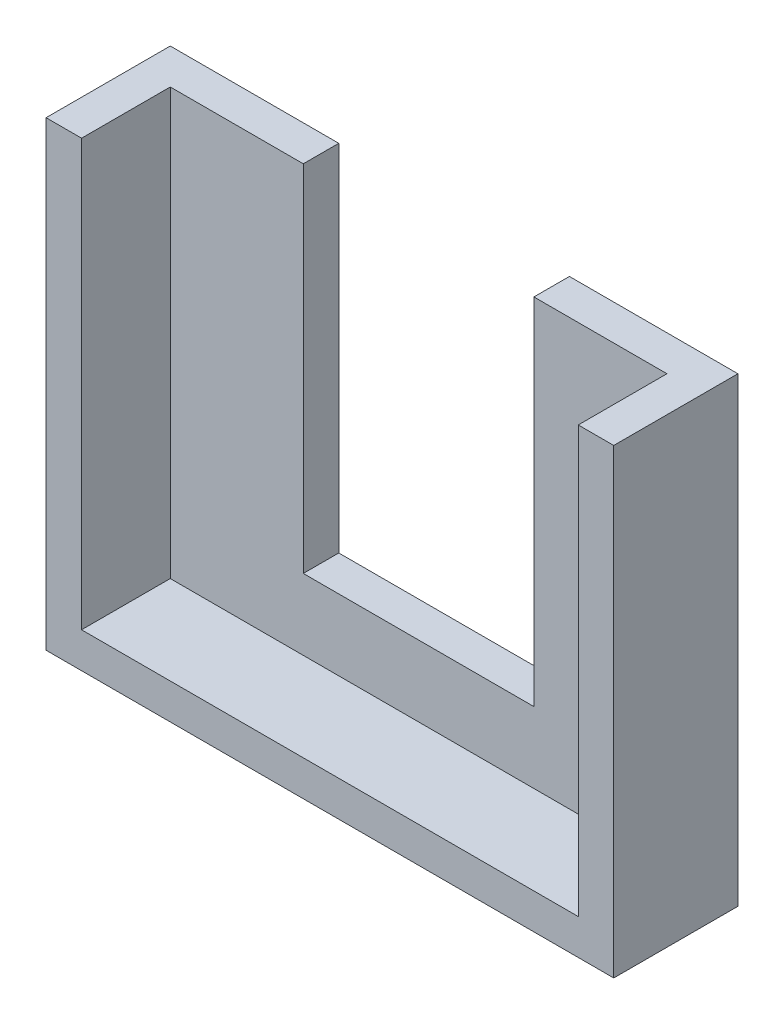
ISO-10303-21;
HEADER;
FILE_DESCRIPTION(('STEP AP214'),'2;1');
FILE_NAME('part.step','',(''),(''),'','','');
FILE_SCHEMA(('AUTOMOTIVE_DESIGN { 1 0 10303 214 1 1 1 1 }'));
ENDSEC;
DATA;
#1=APPLICATION_CONTEXT('core data for automotive mechanical design processes');
#2=APPLICATION_PROTOCOL_DEFINITION('international standard','automotive_design',2000,#1);
#3=PRODUCT_CONTEXT('',#1,'mechanical');
#4=PRODUCT('Part','Part','',(#3));
#5=PRODUCT_RELATED_PRODUCT_CATEGORY('part','',(#4));
#6=PRODUCT_DEFINITION_FORMATION('','',#4);
#7=PRODUCT_DEFINITION_CONTEXT('part definition',#1,'design');
#8=PRODUCT_DEFINITION('design','',#6,#7);
#9=PRODUCT_DEFINITION_SHAPE('','',#8);
#10=(LENGTH_UNIT() NAMED_UNIT(*) SI_UNIT(.MILLI.,.METRE.));
#11=(NAMED_UNIT(*) PLANE_ANGLE_UNIT() SI_UNIT($,.RADIAN.));
#12=(NAMED_UNIT(*) SI_UNIT($,.STERADIAN.) SOLID_ANGLE_UNIT());
#13=UNCERTAINTY_MEASURE_WITH_UNIT(LENGTH_MEASURE(1.E-05),#10,'distance_accuracy_value','');
#14=(GEOMETRIC_REPRESENTATION_CONTEXT(3) GLOBAL_UNCERTAINTY_ASSIGNED_CONTEXT((#13)) GLOBAL_UNIT_ASSIGNED_CONTEXT((#10,
#11,#12)) REPRESENTATION_CONTEXT('',''));
#15=CARTESIAN_POINT('',(0.,0.,0.));
#16=DIRECTION('',(0.,0.,1.));
#17=DIRECTION('',(1.,0.,0.));
#18=AXIS2_PLACEMENT_3D('',#15,#16,#17);
#19=CARTESIAN_POINT('',(0.,0.,10.));
#20=DIRECTION('',(0.,0.,-1.));
#21=DIRECTION('',(-1.,0.,0.));
#22=AXIS2_PLACEMENT_3D('',#19,#20,#21);
#23=PLANE('',#22);
#24=DIRECTION('',(0.,-1.,0.));
#25=VECTOR('',#24,1.);
#26=CARTESIAN_POINT('',(70.,-55.,10.));
#27=LINE('',#26,#25);
#28=CARTESIAN_POINT('',(70.,65.,10.));
#29=VERTEX_POINT('',#28);
#30=CARTESIAN_POINT('',(70.,-55.,10.));
#31=VERTEX_POINT('',#30);
#32=EDGE_CURVE('E144',#29,#31,#27,.T.);
#33=ORIENTED_EDGE('',*,*,#32,.F.);
#34=DIRECTION('',(-1.,0.,0.));
#35=VECTOR('',#34,1.);
#36=CARTESIAN_POINT('',(-80.,65.,10.));
#37=LINE('',#36,#35);
#38=CARTESIAN_POINT('',(32.5,65.,10.));
#39=VERTEX_POINT('',#38);
#40=EDGE_CURVE('E180',#29,#39,#37,.T.);
#41=ORIENTED_EDGE('',*,*,#40,.T.);
#42=DIRECTION('',(0.,1.,0.));
#43=VECTOR('',#42,1.);
#44=CARTESIAN_POINT('',(32.5,-35.,10.));
#45=LINE('',#44,#43);
#46=CARTESIAN_POINT('',(32.5,-35.,10.));
#47=VERTEX_POINT('',#46);
#48=EDGE_CURVE('E160',#47,#39,#45,.T.);
#49=ORIENTED_EDGE('',*,*,#48,.F.);
#50=DIRECTION('',(1.,0.,0.));
#51=VECTOR('',#50,1.);
#52=CARTESIAN_POINT('',(-32.5,-35.,10.));
#53=LINE('',#52,#51);
#54=CARTESIAN_POINT('',(-32.5,-35.,10.));
#55=VERTEX_POINT('',#54);
#56=EDGE_CURVE('E150',#55,#47,#53,.T.);
#57=ORIENTED_EDGE('',*,*,#56,.F.);
#58=DIRECTION('',(0.,-1.,0.));
#59=VECTOR('',#58,1.);
#60=CARTESIAN_POINT('',(-32.5,-35.,10.));
#61=LINE('',#60,#59);
#62=CARTESIAN_POINT('',(-32.5,65.,10.));
#63=VERTEX_POINT('',#62);
#64=EDGE_CURVE('E147',#63,#55,#61,.T.);
#65=ORIENTED_EDGE('',*,*,#64,.F.);
#66=CARTESIAN_POINT('',(-70.,65.,10.));
#67=VERTEX_POINT('',#66);
#68=EDGE_CURVE('E183',#63,#67,#37,.T.);
#69=ORIENTED_EDGE('',*,*,#68,.T.);
#70=DIRECTION('',(0.,1.,0.));
#71=VECTOR('',#70,1.);
#72=CARTESIAN_POINT('',(-70.,65.,10.));
#73=LINE('',#72,#71);
#74=CARTESIAN_POINT('',(-70.,-55.,10.));
#75=VERTEX_POINT('',#74);
#76=EDGE_CURVE('E57',#75,#67,#73,.T.);
#77=ORIENTED_EDGE('',*,*,#76,.F.);
#78=DIRECTION('',(-1.,0.,0.));
#79=VECTOR('',#78,1.);
#80=CARTESIAN_POINT('',(-70.,-55.,10.));
#81=LINE('',#80,#79);
#82=EDGE_CURVE('E52',#31,#75,#81,.T.);
#83=ORIENTED_EDGE('',*,*,#82,.F.);
#84=EDGE_LOOP('',(#33,#41,#49,#57,#65,#69,#77,#83));
#85=FACE_BOUND('',#84,.T.);
#86=ADVANCED_FACE('F37',(#85),#23,.F.);
#87=CARTESIAN_POINT('',(-80.,65.,10.));
#88=DIRECTION('',(0.,-1.,0.));
#89=DIRECTION('',(0.,0.,-1.));
#90=AXIS2_PLACEMENT_3D('',#87,#88,#89);
#91=PLANE('',#90);
#92=DIRECTION('',(-1.,0.,0.));
#93=VECTOR('',#92,1.);
#94=CARTESIAN_POINT('',(-80.,65.,0.));
#95=LINE('',#94,#93);
#96=CARTESIAN_POINT('',(80.,65.,0.));
#97=VERTEX_POINT('',#96);
#98=CARTESIAN_POINT('',(32.5,65.,0.));
#99=VERTEX_POINT('',#98);
#100=EDGE_CURVE('E187',#97,#99,#95,.T.);
#101=ORIENTED_EDGE('',*,*,#100,.T.);
#102=DIRECTION('',(0.,0.,1.));
#103=VECTOR('',#102,1.);
#104=CARTESIAN_POINT('',(32.5,65.,0.));
#105=LINE('',#104,#103);
#106=EDGE_CURVE('E165',#99,#39,#105,.T.);
#107=ORIENTED_EDGE('',*,*,#106,.T.);
#108=ORIENTED_EDGE('',*,*,#40,.F.);
#109=DIRECTION('',(0.,0.,-1.));
#110=VECTOR('',#109,1.);
#111=CARTESIAN_POINT('',(70.,65.,35.));
#112=LINE('',#111,#110);
#113=CARTESIAN_POINT('',(70.,65.,35.));
#114=VERTEX_POINT('',#113);
#115=EDGE_CURVE('E152',#114,#29,#112,.T.);
#116=ORIENTED_EDGE('',*,*,#115,.F.);
#117=DIRECTION('',(-1.,0.,0.));
#118=VECTOR('',#117,1.);
#119=CARTESIAN_POINT('',(70.,65.,35.));
#120=LINE('',#119,#118);
#121=CARTESIAN_POINT('',(80.,65.,35.));
#122=VERTEX_POINT('',#121);
#123=EDGE_CURVE('E220',#122,#114,#120,.T.);
#124=ORIENTED_EDGE('',*,*,#123,.F.);
#125=DIRECTION('',(0.,0.,-1.));
#126=VECTOR('',#125,1.);
#127=CARTESIAN_POINT('',(80.,65.,10.));
#128=LINE('',#127,#126);
#129=EDGE_CURVE('E11',#122,#97,#128,.T.);
#130=ORIENTED_EDGE('',*,*,#129,.T.);
#131=EDGE_LOOP('',(#101,#107,#108,#116,#124,#130));
#132=FACE_BOUND('',#131,.T.);
#133=ADVANCED_FACE('F238',(#132),#91,.F.);
#134=CARTESIAN_POINT('',(80.,-65.,10.));
#135=DIRECTION('',(-1.,0.,0.));
#136=DIRECTION('',(0.,0.,1.));
#137=AXIS2_PLACEMENT_3D('',#134,#135,#136);
#138=PLANE('',#137);
#139=DIRECTION('',(0.,1.,0.));
#140=VECTOR('',#139,1.);
#141=CARTESIAN_POINT('',(80.,-65.,0.));
#142=LINE('',#141,#140);
#143=CARTESIAN_POINT('',(80.,-65.,0.));
#144=VERTEX_POINT('',#143);
#145=EDGE_CURVE('E173',#144,#97,#142,.T.);
#146=ORIENTED_EDGE('',*,*,#145,.T.);
#147=ORIENTED_EDGE('',*,*,#129,.F.);
#148=DIRECTION('',(0.,1.,0.));
#149=VECTOR('',#148,1.);
#150=CARTESIAN_POINT('',(80.,65.,35.));
#151=LINE('',#150,#149);
#152=CARTESIAN_POINT('',(80.,-65.,35.));
#153=VERTEX_POINT('',#152);
#154=EDGE_CURVE('E218',#153,#122,#151,.T.);
#155=ORIENTED_EDGE('',*,*,#154,.F.);
#156=DIRECTION('',(0.,0.,-1.));
#157=VECTOR('',#156,1.);
#158=CARTESIAN_POINT('',(80.,-65.,10.));
#159=LINE('',#158,#157);
#160=EDGE_CURVE('E182',#153,#144,#159,.T.);
#161=ORIENTED_EDGE('',*,*,#160,.T.);
#162=EDGE_LOOP('',(#146,#147,#155,#161));
#163=FACE_BOUND('',#162,.T.);
#164=ADVANCED_FACE('F39',(#163),#138,.F.);
#165=ORIENTED_EDGE('',*,*,#68,.F.);
#166=DIRECTION('',(0.,0.,1.));
#167=VECTOR('',#166,1.);
#168=CARTESIAN_POINT('',(-32.5,65.,0.));
#169=LINE('',#168,#167);
#170=CARTESIAN_POINT('',(-32.5,65.,0.));
#171=VERTEX_POINT('',#170);
#172=EDGE_CURVE('E176',#171,#63,#169,.T.);
#173=ORIENTED_EDGE('',*,*,#172,.F.);
#174=CARTESIAN_POINT('',(-80.,65.,0.));
#175=VERTEX_POINT('',#174);
#176=EDGE_CURVE('E186',#171,#175,#95,.T.);
#177=ORIENTED_EDGE('',*,*,#176,.T.);
#178=DIRECTION('',(0.,0.,-1.));
#179=VECTOR('',#178,1.);
#180=CARTESIAN_POINT('',(-80.,65.,10.));
#181=LINE('',#180,#179);
#182=CARTESIAN_POINT('',(-80.,65.,35.));
#183=VERTEX_POINT('',#182);
#184=EDGE_CURVE('E45',#183,#175,#181,.T.);
#185=ORIENTED_EDGE('',*,*,#184,.F.);
#186=DIRECTION('',(-1.,0.,0.));
#187=VECTOR('',#186,1.);
#188=CARTESIAN_POINT('',(-80.,65.,35.));
#189=LINE('',#188,#187);
#190=CARTESIAN_POINT('',(-70.,65.,35.));
#191=VERTEX_POINT('',#190);
#192=EDGE_CURVE('E134',#191,#183,#189,.T.);
#193=ORIENTED_EDGE('',*,*,#192,.F.);
#194=DIRECTION('',(0.,0.,-1.));
#195=VECTOR('',#194,1.);
#196=CARTESIAN_POINT('',(-70.,65.,35.));
#197=LINE('',#196,#195);
#198=EDGE_CURVE('E130',#191,#67,#197,.T.);
#199=ORIENTED_EDGE('',*,*,#198,.T.);
#200=EDGE_LOOP('',(#165,#173,#177,#185,#193,#199));
#201=FACE_BOUND('',#200,.T.);
#202=ADVANCED_FACE('F251',(#201),#91,.F.);
#203=CARTESIAN_POINT('',(-80.,-65.,10.));
#204=DIRECTION('',(1.,0.,0.));
#205=DIRECTION('',(0.,0.,-1.));
#206=AXIS2_PLACEMENT_3D('',#203,#204,#205);
#207=PLANE('',#206);
#208=DIRECTION('',(0.,-1.,0.));
#209=VECTOR('',#208,1.);
#210=CARTESIAN_POINT('',(-80.,-65.,0.));
#211=LINE('',#210,#209);
#212=CARTESIAN_POINT('',(-80.,-65.,0.));
#213=VERTEX_POINT('',#212);
#214=EDGE_CURVE('E190',#175,#213,#211,.T.);
#215=ORIENTED_EDGE('',*,*,#214,.T.);
#216=DIRECTION('',(0.,0.,-1.));
#217=VECTOR('',#216,1.);
#218=CARTESIAN_POINT('',(-80.,-65.,10.));
#219=LINE('',#218,#217);
#220=CARTESIAN_POINT('',(-80.,-65.,35.));
#221=VERTEX_POINT('',#220);
#222=EDGE_CURVE('E196',#221,#213,#219,.T.);
#223=ORIENTED_EDGE('',*,*,#222,.F.);
#224=DIRECTION('',(0.,-1.,0.));
#225=VECTOR('',#224,1.);
#226=CARTESIAN_POINT('',(-80.,-65.,35.));
#227=LINE('',#226,#225);
#228=EDGE_CURVE('E204',#183,#221,#227,.T.);
#229=ORIENTED_EDGE('',*,*,#228,.F.);
#230=ORIENTED_EDGE('',*,*,#184,.T.);
#231=EDGE_LOOP('',(#215,#223,#229,#230));
#232=FACE_BOUND('',#231,.T.);
#233=ADVANCED_FACE('F202',(#232),#207,.F.);
#234=CARTESIAN_POINT('',(-80.,-65.,10.));
#235=DIRECTION('',(0.,1.,0.));
#236=DIRECTION('',(0.,0.,1.));
#237=AXIS2_PLACEMENT_3D('',#234,#235,#236);
#238=PLANE('',#237);
#239=DIRECTION('',(1.,0.,0.));
#240=VECTOR('',#239,1.);
#241=CARTESIAN_POINT('',(-80.,-65.,0.));
#242=LINE('',#241,#240);
#243=EDGE_CURVE('E192',#213,#144,#242,.T.);
#244=ORIENTED_EDGE('',*,*,#243,.T.);
#245=ORIENTED_EDGE('',*,*,#160,.F.);
#246=DIRECTION('',(1.,0.,0.));
#247=VECTOR('',#246,1.);
#248=CARTESIAN_POINT('',(80.,-65.,35.));
#249=LINE('',#248,#247);
#250=EDGE_CURVE('E221',#221,#153,#249,.T.);
#251=ORIENTED_EDGE('',*,*,#250,.F.);
#252=ORIENTED_EDGE('',*,*,#222,.T.);
#253=EDGE_LOOP('',(#244,#245,#251,#252));
#254=FACE_BOUND('',#253,.T.);
#255=ADVANCED_FACE('F212',(#254),#238,.F.);
#256=CARTESIAN_POINT('',(0.,0.,0.));
#257=DIRECTION('',(0.,0.,-1.));
#258=DIRECTION('',(-1.,0.,0.));
#259=AXIS2_PLACEMENT_3D('',#256,#257,#258);
#260=PLANE('',#259);
#261=DIRECTION('',(0.,1.,0.));
#262=VECTOR('',#261,1.);
#263=CARTESIAN_POINT('',(32.5,65.,0.));
#264=LINE('',#263,#262);
#265=CARTESIAN_POINT('',(32.5,-35.,0.));
#266=VERTEX_POINT('',#265);
#267=EDGE_CURVE('E156',#266,#99,#264,.T.);
#268=ORIENTED_EDGE('',*,*,#267,.T.);
#269=ORIENTED_EDGE('',*,*,#100,.F.);
#270=ORIENTED_EDGE('',*,*,#145,.F.);
#271=ORIENTED_EDGE('',*,*,#243,.F.);
#272=ORIENTED_EDGE('',*,*,#214,.F.);
#273=ORIENTED_EDGE('',*,*,#176,.F.);
#274=DIRECTION('',(0.,-1.,0.));
#275=VECTOR('',#274,1.);
#276=CARTESIAN_POINT('',(-32.5,35.,0.));
#277=LINE('',#276,#275);
#278=CARTESIAN_POINT('',(-32.5,-35.,0.));
#279=VERTEX_POINT('',#278);
#280=EDGE_CURVE('E159',#171,#279,#277,.T.);
#281=ORIENTED_EDGE('',*,*,#280,.T.);
#282=DIRECTION('',(1.,0.,0.));
#283=VECTOR('',#282,1.);
#284=CARTESIAN_POINT('',(-32.5,-35.,0.));
#285=LINE('',#284,#283);
#286=EDGE_CURVE('E163',#279,#266,#285,.T.);
#287=ORIENTED_EDGE('',*,*,#286,.T.);
#288=EDGE_LOOP('',(#268,#269,#270,#271,#272,#273,#281,#287));
#289=FACE_BOUND('',#288,.T.);
#290=ADVANCED_FACE('F209',(#289),#260,.T.);
#291=CARTESIAN_POINT('',(32.5,-35.,0.));
#292=DIRECTION('',(1.,0.,0.));
#293=DIRECTION('',(0.,0.,-1.));
#294=AXIS2_PLACEMENT_3D('',#291,#292,#293);
#295=PLANE('',#294);
#296=ORIENTED_EDGE('',*,*,#48,.T.);
#297=ORIENTED_EDGE('',*,*,#106,.F.);
#298=ORIENTED_EDGE('',*,*,#267,.F.);
#299=DIRECTION('',(0.,0.,1.));
#300=VECTOR('',#299,1.);
#301=CARTESIAN_POINT('',(32.5,-35.,0.));
#302=LINE('',#301,#300);
#303=EDGE_CURVE('E171',#266,#47,#302,.T.);
#304=ORIENTED_EDGE('',*,*,#303,.T.);
#305=EDGE_LOOP('',(#296,#297,#298,#304));
#306=FACE_BOUND('',#305,.T.);
#307=ADVANCED_FACE('F242',(#306),#295,.F.);
#308=CARTESIAN_POINT('',(-32.5,-35.,0.));
#309=DIRECTION('',(0.,-1.,0.));
#310=DIRECTION('',(0.,0.,-1.));
#311=AXIS2_PLACEMENT_3D('',#308,#309,#310);
#312=PLANE('',#311);
#313=ORIENTED_EDGE('',*,*,#56,.T.);
#314=ORIENTED_EDGE('',*,*,#303,.F.);
#315=ORIENTED_EDGE('',*,*,#286,.F.);
#316=DIRECTION('',(0.,0.,1.));
#317=VECTOR('',#316,1.);
#318=CARTESIAN_POINT('',(-32.5,-35.,0.));
#319=LINE('',#318,#317);
#320=EDGE_CURVE('E174',#279,#55,#319,.T.);
#321=ORIENTED_EDGE('',*,*,#320,.T.);
#322=EDGE_LOOP('',(#313,#314,#315,#321));
#323=FACE_BOUND('',#322,.T.);
#324=ADVANCED_FACE('F245',(#323),#312,.F.);
#325=CARTESIAN_POINT('',(-32.5,-35.,0.));
#326=DIRECTION('',(-1.,0.,0.));
#327=DIRECTION('',(0.,0.,1.));
#328=AXIS2_PLACEMENT_3D('',#325,#326,#327);
#329=PLANE('',#328);
#330=ORIENTED_EDGE('',*,*,#64,.T.);
#331=ORIENTED_EDGE('',*,*,#320,.F.);
#332=ORIENTED_EDGE('',*,*,#280,.F.);
#333=ORIENTED_EDGE('',*,*,#172,.T.);
#334=EDGE_LOOP('',(#330,#331,#332,#333));
#335=FACE_BOUND('',#334,.T.);
#336=ADVANCED_FACE('F253',(#335),#329,.F.);
#337=CARTESIAN_POINT('',(-70.,-55.,35.));
#338=DIRECTION('',(0.,-1.,0.));
#339=DIRECTION('',(0.,0.,-1.));
#340=AXIS2_PLACEMENT_3D('',#337,#338,#339);
#341=PLANE('',#340);
#342=ORIENTED_EDGE('',*,*,#82,.T.);
#343=DIRECTION('',(0.,0.,-1.));
#344=VECTOR('',#343,1.);
#345=CARTESIAN_POINT('',(-70.,-55.,35.));
#346=LINE('',#345,#344);
#347=CARTESIAN_POINT('',(-70.,-55.,35.));
#348=VERTEX_POINT('',#347);
#349=EDGE_CURVE('E128',#348,#75,#346,.T.);
#350=ORIENTED_EDGE('',*,*,#349,.F.);
#351=DIRECTION('',(-1.,0.,0.));
#352=VECTOR('',#351,1.);
#353=CARTESIAN_POINT('',(-70.,-55.,35.));
#354=LINE('',#353,#352);
#355=CARTESIAN_POINT('',(70.,-55.,35.));
#356=VERTEX_POINT('',#355);
#357=EDGE_CURVE('E135',#356,#348,#354,.T.);
#358=ORIENTED_EDGE('',*,*,#357,.F.);
#359=DIRECTION('',(0.,0.,-1.));
#360=VECTOR('',#359,1.);
#361=CARTESIAN_POINT('',(70.,-55.,35.));
#362=LINE('',#361,#360);
#363=EDGE_CURVE('E228',#356,#31,#362,.T.);
#364=ORIENTED_EDGE('',*,*,#363,.T.);
#365=EDGE_LOOP('',(#342,#350,#358,#364));
#366=FACE_BOUND('',#365,.T.);
#367=ADVANCED_FACE('F146',(#366),#341,.F.);
#368=CARTESIAN_POINT('',(-70.,65.,35.));
#369=DIRECTION('',(-1.,0.,0.));
#370=DIRECTION('',(0.,-1.,0.));
#371=AXIS2_PLACEMENT_3D('',#368,#369,#370);
#372=PLANE('',#371);
#373=ORIENTED_EDGE('',*,*,#76,.T.);
#374=ORIENTED_EDGE('',*,*,#198,.F.);
#375=DIRECTION('',(0.,1.,0.));
#376=VECTOR('',#375,1.);
#377=CARTESIAN_POINT('',(-70.,65.,35.));
#378=LINE('',#377,#376);
#379=EDGE_CURVE('E124',#348,#191,#378,.T.);
#380=ORIENTED_EDGE('',*,*,#379,.F.);
#381=ORIENTED_EDGE('',*,*,#349,.T.);
#382=EDGE_LOOP('',(#373,#374,#380,#381));
#383=FACE_BOUND('',#382,.T.);
#384=ADVANCED_FACE('F126',(#383),#372,.F.);
#385=CARTESIAN_POINT('',(70.,-55.,35.));
#386=DIRECTION('',(1.,0.,0.));
#387=DIRECTION('',(0.,0.,-1.));
#388=AXIS2_PLACEMENT_3D('',#385,#386,#387);
#389=PLANE('',#388);
#390=ORIENTED_EDGE('',*,*,#32,.T.);
#391=ORIENTED_EDGE('',*,*,#363,.F.);
#392=DIRECTION('',(0.,-1.,0.));
#393=VECTOR('',#392,1.);
#394=CARTESIAN_POINT('',(70.,-55.,35.));
#395=LINE('',#394,#393);
#396=EDGE_CURVE('E140',#114,#356,#395,.T.);
#397=ORIENTED_EDGE('',*,*,#396,.F.);
#398=ORIENTED_EDGE('',*,*,#115,.T.);
#399=EDGE_LOOP('',(#390,#391,#397,#398));
#400=FACE_BOUND('',#399,.T.);
#401=ADVANCED_FACE('F235',(#400),#389,.F.);
#402=CARTESIAN_POINT('',(0.,0.,35.));
#403=DIRECTION('',(0.,0.,1.));
#404=DIRECTION('',(1.,0.,0.));
#405=AXIS2_PLACEMENT_3D('',#402,#403,#404);
#406=PLANE('',#405);
#407=ORIENTED_EDGE('',*,*,#357,.T.);
#408=ORIENTED_EDGE('',*,*,#379,.T.);
#409=ORIENTED_EDGE('',*,*,#192,.T.);
#410=ORIENTED_EDGE('',*,*,#228,.T.);
#411=ORIENTED_EDGE('',*,*,#250,.T.);
#412=ORIENTED_EDGE('',*,*,#154,.T.);
#413=ORIENTED_EDGE('',*,*,#123,.T.);
#414=ORIENTED_EDGE('',*,*,#396,.T.);
#415=EDGE_LOOP('',(#407,#408,#409,#410,#411,#412,#413,#414));
#416=FACE_BOUND('',#415,.T.);
#417=ADVANCED_FACE('F138',(#416),#406,.T.);
#418=CLOSED_SHELL('',(#86,#133,#164,#202,#233,#255,#290,#307,#324,#336,#367,#384,#401,#417));
#419=MANIFOLD_SOLID_BREP('B2',#418);
#420=ADVANCED_BREP_SHAPE_REPRESENTATION('',(#18,#419),#14);
#421=SHAPE_DEFINITION_REPRESENTATION(#9,#420);
ENDSEC;
END-ISO-10303-21;
